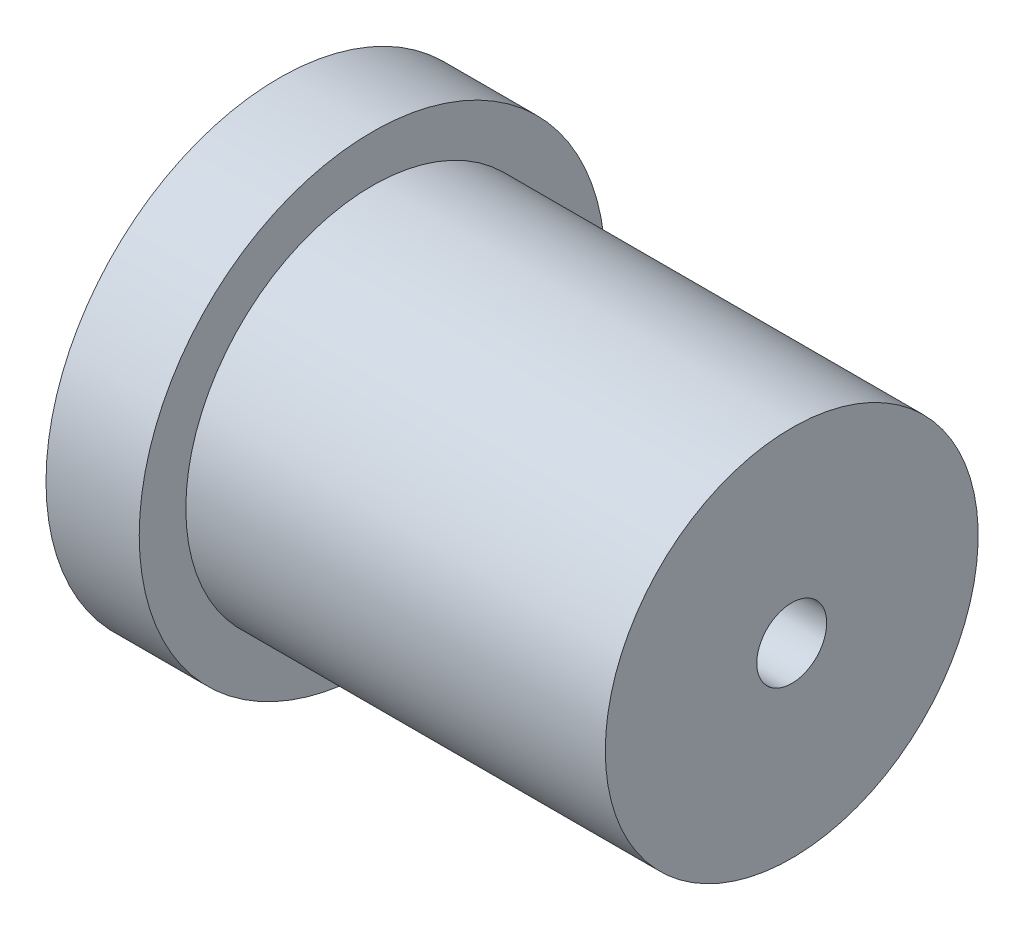
ISO-10303-21;
HEADER;
FILE_DESCRIPTION(('STEP AP214'),'2;1');
FILE_NAME('part.step','',(''),(''),'','','');
FILE_SCHEMA(('AUTOMOTIVE_DESIGN { 1 0 10303 214 1 1 1 1 }'));
ENDSEC;
DATA;
#1=APPLICATION_CONTEXT('core data for automotive mechanical design processes');
#2=APPLICATION_PROTOCOL_DEFINITION('international standard','automotive_design',2000,#1);
#3=PRODUCT_CONTEXT('',#1,'mechanical');
#4=PRODUCT('Part','Part','',(#3));
#5=PRODUCT_RELATED_PRODUCT_CATEGORY('part','',(#4));
#6=PRODUCT_DEFINITION_FORMATION('','',#4);
#7=PRODUCT_DEFINITION_CONTEXT('part definition',#1,'design');
#8=PRODUCT_DEFINITION('design','',#6,#7);
#9=PRODUCT_DEFINITION_SHAPE('','',#8);
#10=(LENGTH_UNIT() NAMED_UNIT(*) SI_UNIT(.MILLI.,.METRE.));
#11=(NAMED_UNIT(*) PLANE_ANGLE_UNIT() SI_UNIT($,.RADIAN.));
#12=(NAMED_UNIT(*) SI_UNIT($,.STERADIAN.) SOLID_ANGLE_UNIT());
#13=UNCERTAINTY_MEASURE_WITH_UNIT(LENGTH_MEASURE(1.E-05),#10,'distance_accuracy_value','');
#14=(GEOMETRIC_REPRESENTATION_CONTEXT(3) GLOBAL_UNCERTAINTY_ASSIGNED_CONTEXT((#13)) GLOBAL_UNIT_ASSIGNED_CONTEXT((#10,
#11,#12)) REPRESENTATION_CONTEXT('',''));
#15=CARTESIAN_POINT('',(0.,0.,0.));
#16=DIRECTION('',(0.,0.,1.));
#17=DIRECTION('',(1.,0.,0.));
#18=AXIS2_PLACEMENT_3D('',#15,#16,#17);
#19=CARTESIAN_POINT('',(-2.75,0.375,0.));
#20=DIRECTION('',(1.,0.,0.));
#21=DIRECTION('',(0.,0.,-1.));
#22=AXIS2_PLACEMENT_3D('',#19,#20,#21);
#23=PLANE('',#22);
#24=CARTESIAN_POINT('',(-2.75,0.,0.));
#25=DIRECTION('',(-1.,0.,0.));
#26=DIRECTION('',(0.,0.,1.));
#27=AXIS2_PLACEMENT_3D('',#24,#25,#26);
#28=CIRCLE('',#27,0.375);
#29=CARTESIAN_POINT('',(-2.75,0.,0.375));
#30=VERTEX_POINT('',#29);
#31=EDGE_CURVE('E54',#30,#30,#28,.T.);
#32=ORIENTED_EDGE('',*,*,#31,.F.);
#33=EDGE_LOOP('',(#32));
#34=FACE_BOUND('',#33,.T.);
#35=CARTESIAN_POINT('',(-2.75,0.,0.));
#36=DIRECTION('',(-1.,0.,0.));
#37=DIRECTION('',(0.,0.,1.));
#38=AXIS2_PLACEMENT_3D('',#35,#36,#37);
#39=CIRCLE('',#38,2.5);
#40=CARTESIAN_POINT('',(-2.75,0.,2.5));
#41=VERTEX_POINT('',#40);
#42=EDGE_CURVE('E10',#41,#41,#39,.T.);
#43=ORIENTED_EDGE('',*,*,#42,.T.);
#44=EDGE_LOOP('',(#43));
#45=FACE_BOUND('',#44,.T.);
#46=ADVANCED_FACE('F32',(#34,#45),#23,.F.);
#47=CARTESIAN_POINT('',(-2.75,0.,0.));
#48=DIRECTION('',(-1.,0.,0.));
#49=DIRECTION('',(0.,0.,1.));
#50=AXIS2_PLACEMENT_3D('',#47,#48,#49);
#51=CYLINDRICAL_SURFACE('',#50,2.5);
#52=ORIENTED_EDGE('',*,*,#42,.F.);
#53=EDGE_LOOP('',(#52));
#54=FACE_BOUND('',#53,.T.);
#55=CARTESIAN_POINT('',(-1.75,0.,0.));
#56=DIRECTION('',(-1.,0.,0.));
#57=DIRECTION('',(0.,0.,1.));
#58=AXIS2_PLACEMENT_3D('',#55,#56,#57);
#59=CIRCLE('',#58,2.5);
#60=CARTESIAN_POINT('',(-1.75,0.,2.5));
#61=VERTEX_POINT('',#60);
#62=EDGE_CURVE('E38',#61,#61,#59,.T.);
#63=ORIENTED_EDGE('',*,*,#62,.T.);
#64=EDGE_LOOP('',(#63));
#65=FACE_BOUND('',#64,.T.);
#66=ADVANCED_FACE('F61',(#54,#65),#51,.T.);
#67=CARTESIAN_POINT('',(-1.75,2.5,0.));
#68=DIRECTION('',(-1.,0.,0.));
#69=DIRECTION('',(0.,0.,1.));
#70=AXIS2_PLACEMENT_3D('',#67,#68,#69);
#71=PLANE('',#70);
#72=ORIENTED_EDGE('',*,*,#62,.F.);
#73=EDGE_LOOP('',(#72));
#74=FACE_BOUND('',#73,.T.);
#75=CARTESIAN_POINT('',(-1.75,0.,0.));
#76=DIRECTION('',(-1.,0.,0.));
#77=DIRECTION('',(0.,0.,1.));
#78=AXIS2_PLACEMENT_3D('',#75,#76,#77);
#79=CIRCLE('',#78,2.);
#80=CARTESIAN_POINT('',(-1.75,0.,2.));
#81=VERTEX_POINT('',#80);
#82=EDGE_CURVE('E42',#81,#81,#79,.T.);
#83=ORIENTED_EDGE('',*,*,#82,.T.);
#84=EDGE_LOOP('',(#83));
#85=FACE_BOUND('',#84,.T.);
#86=ADVANCED_FACE('F65',(#74,#85),#71,.F.);
#87=CARTESIAN_POINT('',(-2.75,0.,0.));
#88=DIRECTION('',(-1.,0.,0.));
#89=DIRECTION('',(0.,0.,1.));
#90=AXIS2_PLACEMENT_3D('',#87,#88,#89);
#91=CYLINDRICAL_SURFACE('',#90,2.);
#92=ORIENTED_EDGE('',*,*,#82,.F.);
#93=EDGE_LOOP('',(#92));
#94=FACE_BOUND('',#93,.T.);
#95=CARTESIAN_POINT('',(2.75,0.,0.));
#96=DIRECTION('',(-1.,0.,0.));
#97=DIRECTION('',(0.,0.,1.));
#98=AXIS2_PLACEMENT_3D('',#95,#96,#97);
#99=CIRCLE('',#98,2.);
#100=CARTESIAN_POINT('',(2.75,0.,2.));
#101=VERTEX_POINT('',#100);
#102=EDGE_CURVE('E46',#101,#101,#99,.T.);
#103=ORIENTED_EDGE('',*,*,#102,.T.);
#104=EDGE_LOOP('',(#103));
#105=FACE_BOUND('',#104,.T.);
#106=ADVANCED_FACE('F70',(#94,#105),#91,.T.);
#107=CARTESIAN_POINT('',(2.75,0.375,0.));
#108=DIRECTION('',(-1.,0.,0.));
#109=DIRECTION('',(0.,0.,1.));
#110=AXIS2_PLACEMENT_3D('',#107,#108,#109);
#111=PLANE('',#110);
#112=ORIENTED_EDGE('',*,*,#102,.F.);
#113=EDGE_LOOP('',(#112));
#114=FACE_BOUND('',#113,.T.);
#115=CARTESIAN_POINT('',(2.75,0.,0.));
#116=DIRECTION('',(-1.,0.,0.));
#117=DIRECTION('',(0.,0.,1.));
#118=AXIS2_PLACEMENT_3D('',#115,#116,#117);
#119=CIRCLE('',#118,0.375);
#120=CARTESIAN_POINT('',(2.75,0.,0.375));
#121=VERTEX_POINT('',#120);
#122=EDGE_CURVE('E51',#121,#121,#119,.T.);
#123=ORIENTED_EDGE('',*,*,#122,.T.);
#124=EDGE_LOOP('',(#123));
#125=FACE_BOUND('',#124,.T.);
#126=ADVANCED_FACE('F76',(#114,#125),#111,.F.);
#127=CARTESIAN_POINT('',(-2.75,0.,0.));
#128=DIRECTION('',(-1.,0.,0.));
#129=DIRECTION('',(0.,0.,1.));
#130=AXIS2_PLACEMENT_3D('',#127,#128,#129);
#131=CYLINDRICAL_SURFACE('',#130,0.375);
#132=ORIENTED_EDGE('',*,*,#122,.F.);
#133=EDGE_LOOP('',(#132));
#134=FACE_BOUND('',#133,.T.);
#135=ORIENTED_EDGE('',*,*,#31,.T.);
#136=EDGE_LOOP('',(#135));
#137=FACE_BOUND('',#136,.T.);
#138=ADVANCED_FACE('F58',(#134,#137),#131,.F.);
#139=CLOSED_SHELL('',(#46,#66,#86,#106,#126,#138));
#140=MANIFOLD_SOLID_BREP('B2',#139);
#141=ADVANCED_BREP_SHAPE_REPRESENTATION('',(#18,#140),#14);
#142=SHAPE_DEFINITION_REPRESENTATION(#9,#141);
ENDSEC;
END-ISO-10303-21;
